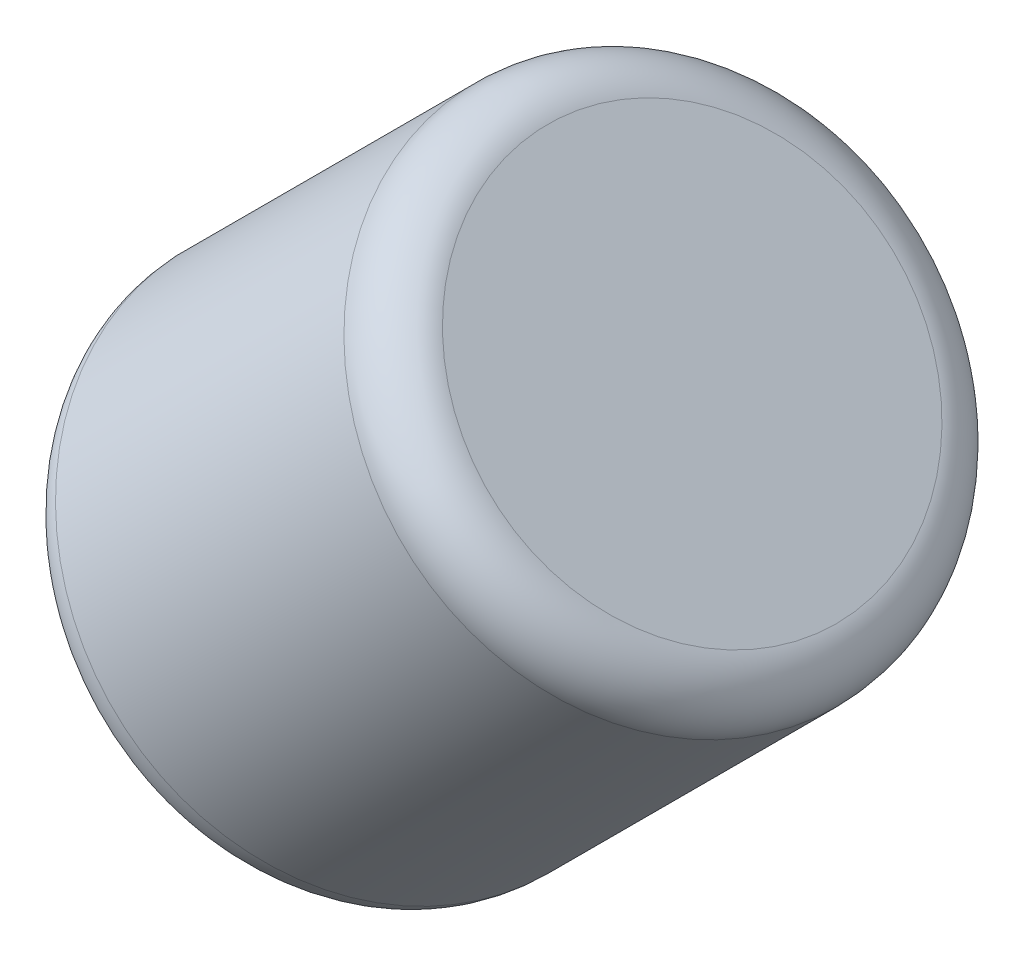
ISO-10303-21;
HEADER;
FILE_DESCRIPTION(('STEP AP214'),'2;1');
FILE_NAME('part.step','',(''),(''),'','','');
FILE_SCHEMA(('AUTOMOTIVE_DESIGN { 1 0 10303 214 1 1 1 1 }'));
ENDSEC;
DATA;
#1=APPLICATION_CONTEXT('core data for automotive mechanical design processes');
#2=APPLICATION_PROTOCOL_DEFINITION('international standard','automotive_design',2000,#1);
#3=PRODUCT_CONTEXT('',#1,'mechanical');
#4=PRODUCT('Part','Part','',(#3));
#5=PRODUCT_RELATED_PRODUCT_CATEGORY('part','',(#4));
#6=PRODUCT_DEFINITION_FORMATION('','',#4);
#7=PRODUCT_DEFINITION_CONTEXT('part definition',#1,'design');
#8=PRODUCT_DEFINITION('design','',#6,#7);
#9=PRODUCT_DEFINITION_SHAPE('','',#8);
#10=(LENGTH_UNIT() NAMED_UNIT(*) SI_UNIT(.MILLI.,.METRE.));
#11=(NAMED_UNIT(*) PLANE_ANGLE_UNIT() SI_UNIT($,.RADIAN.));
#12=(NAMED_UNIT(*) SI_UNIT($,.STERADIAN.) SOLID_ANGLE_UNIT());
#13=UNCERTAINTY_MEASURE_WITH_UNIT(LENGTH_MEASURE(1.E-05),#10,'distance_accuracy_value','');
#14=(GEOMETRIC_REPRESENTATION_CONTEXT(3) GLOBAL_UNCERTAINTY_ASSIGNED_CONTEXT((#13)) GLOBAL_UNIT_ASSIGNED_CONTEXT((#10,
#11,#12)) REPRESENTATION_CONTEXT('',''));
#15=CARTESIAN_POINT('',(0.,0.,0.));
#16=DIRECTION('',(0.,0.,1.));
#17=DIRECTION('',(1.,0.,0.));
#18=AXIS2_PLACEMENT_3D('',#15,#16,#17);
#19=CARTESIAN_POINT('',(3.20710678118623,28.0571067811868,0.));
#20=DIRECTION('',(-0.707106781186298,-0.707106781186797,0.));
#21=DIRECTION('',(0.707106781186797,-0.707106781186298,0.));
#22=AXIS2_PLACEMENT_3D('',#19,#20,#21);
#23=PLANE('',#22);
#24=CARTESIAN_POINT('',(3.20710678118623,28.0571067811867,0.));
#25=DIRECTION('',(-0.707106781186298,-0.707106781186797,0.));
#26=DIRECTION('',(0.707106781186797,-0.707106781186298,0.));
#27=AXIS2_PLACEMENT_3D('',#24,#25,#26);
#28=CIRCLE('',#27,0.799999943848962);
#29=CARTESIAN_POINT('',(3.77279216643089,27.4914213959425,0.));
#30=VERTEX_POINT('',#29);
#31=EDGE_CURVE('E30',#30,#30,#28,.T.);
#32=ORIENTED_EDGE('',*,*,#31,.F.);
#33=EDGE_LOOP('',(#32));
#34=FACE_BOUND('',#33,.T.);
#35=ADVANCED_FACE('F15',(#34),#23,.F.);
#36=CARTESIAN_POINT('',(3.06568542494924,27.9156854249497,0.));
#37=DIRECTION('',(-0.707106781186298,-0.707106781186797,0.));
#38=DIRECTION('',(0.707106781186797,-0.707106781186298,0.));
#39=AXIS2_PLACEMENT_3D('',#36,#37,#38);
#40=TOROIDAL_SURFACE('',#39,0.80000000000084,0.199999999999233);
#41=ORIENTED_EDGE('',*,*,#31,.T.);
#42=EDGE_LOOP('',(#41));
#43=FACE_BOUND('',#42,.T.);
#44=CARTESIAN_POINT('',(3.06568542494895,27.9156854249493,0.));
#45=DIRECTION('',(-0.707106781186298,-0.707106781186797,0.));
#46=DIRECTION('',(0.707106781186797,-0.707106781186298,0.));
#47=AXIS2_PLACEMENT_3D('',#44,#45,#46);
#48=CIRCLE('',#47,1.00000000000007);
#49=CARTESIAN_POINT('',(3.7727922061358,27.208578643763,0.));
#50=VERTEX_POINT('',#49);
#51=EDGE_CURVE('E26',#50,#50,#48,.T.);
#52=ORIENTED_EDGE('',*,*,#51,.F.);
#53=EDGE_LOOP('',(#52));
#54=FACE_BOUND('',#53,.T.);
#55=ADVANCED_FACE('F36',(#43,#54),#40,.T.);
#56=CARTESIAN_POINT('',(1.7928932188135,26.642893218813,0.));
#57=DIRECTION('',(-0.707106781186298,-0.707106781186797,0.));
#58=DIRECTION('',(0.707106781186797,-0.707106781186298,0.));
#59=AXIS2_PLACEMENT_3D('',#56,#57,#58);
#60=CYLINDRICAL_SURFACE('',#59,0.999999999999965);
#61=CARTESIAN_POINT('',(1.93431457505061,26.7843145750502,0.));
#62=DIRECTION('',(-0.707106781186298,-0.707106781186797,0.));
#63=DIRECTION('',(0.707106781186797,-0.707106781186298,0.));
#64=AXIS2_PLACEMENT_3D('',#61,#62,#63);
#65=CIRCLE('',#64,0.999999999999844);
#66=CARTESIAN_POINT('',(2.6414213562373,26.077207793864,0.));
#67=VERTEX_POINT('',#66);
#68=EDGE_CURVE('E22',#67,#67,#65,.T.);
#69=ORIENTED_EDGE('',*,*,#68,.F.);
#70=EDGE_LOOP('',(#69));
#71=FACE_BOUND('',#70,.T.);
#72=ORIENTED_EDGE('',*,*,#51,.T.);
#73=EDGE_LOOP('',(#72));
#74=FACE_BOUND('',#73,.T.);
#75=ADVANCED_FACE('F45',(#71,#74),#60,.T.);
#76=CARTESIAN_POINT('',(1.93431457505182,26.7843145750514,0.));
#77=DIRECTION('',(-0.707106781186298,-0.707106781186797,0.));
#78=DIRECTION('',(0.707106781186797,-0.707106781186298,0.));
#79=AXIS2_PLACEMENT_3D('',#76,#77,#78);
#80=TOROIDAL_SURFACE('',#79,0.79999999999822,0.20000000000164);
#81=ORIENTED_EDGE('',*,*,#68,.T.);
#82=EDGE_LOOP('',(#81));
#83=FACE_BOUND('',#82,.T.);
#84=CARTESIAN_POINT('',(1.79289321881346,26.6428932188129,0.));
#85=DIRECTION('',(-0.707106781186298,-0.707106781186797,0.));
#86=DIRECTION('',(0.707106781186797,-0.707106781186298,0.));
#87=AXIS2_PLACEMENT_3D('',#84,#85,#86);
#88=CIRCLE('',#87,0.800000061869449);
#89=CARTESIAN_POINT('',(2.3585786875112,26.0772077501156,0.));
#90=VERTEX_POINT('',#89);
#91=EDGE_CURVE('E10',#90,#90,#88,.T.);
#92=ORIENTED_EDGE('',*,*,#91,.F.);
#93=EDGE_LOOP('',(#92));
#94=FACE_BOUND('',#93,.T.);
#95=ADVANCED_FACE('F49',(#83,#94),#80,.T.);
#96=CARTESIAN_POINT('',(2.35857864376275,26.077207793864,0.));
#97=DIRECTION('',(0.707106781186298,0.707106781186797,0.));
#98=DIRECTION('',(-0.707106781186797,0.707106781186298,0.));
#99=AXIS2_PLACEMENT_3D('',#96,#97,#98);
#100=PLANE('',#99);
#101=ORIENTED_EDGE('',*,*,#91,.T.);
#102=EDGE_LOOP('',(#101));
#103=FACE_BOUND('',#102,.T.);
#104=ADVANCED_FACE('F17',(#103),#100,.F.);
#105=CLOSED_SHELL('',(#35,#55,#75,#95,#104));
#106=MANIFOLD_SOLID_BREP('B1',#105);
#107=ADVANCED_BREP_SHAPE_REPRESENTATION('',(#18,#106),#14);
#108=SHAPE_DEFINITION_REPRESENTATION(#9,#107);
ENDSEC;
END-ISO-10303-21;
